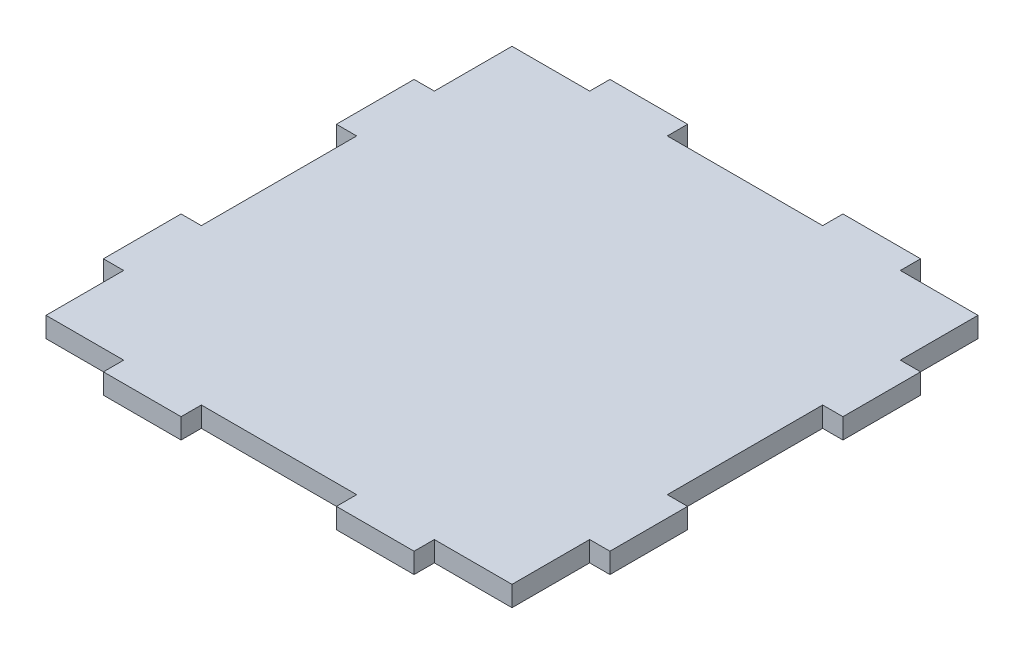
ISO-10303-21;
HEADER;
FILE_DESCRIPTION(('STEP AP214'),'2;1');
FILE_NAME('part.step','',(''),(''),'','','');
FILE_SCHEMA(('AUTOMOTIVE_DESIGN { 1 0 10303 214 1 1 1 1 }'));
ENDSEC;
DATA;
#1=APPLICATION_CONTEXT('core data for automotive mechanical design processes');
#2=APPLICATION_PROTOCOL_DEFINITION('international standard','automotive_design',2000,#1);
#3=PRODUCT_CONTEXT('',#1,'mechanical');
#4=PRODUCT('Part','Part','',(#3));
#5=PRODUCT_RELATED_PRODUCT_CATEGORY('part','',(#4));
#6=PRODUCT_DEFINITION_FORMATION('','',#4);
#7=PRODUCT_DEFINITION_CONTEXT('part definition',#1,'design');
#8=PRODUCT_DEFINITION('design','',#6,#7);
#9=PRODUCT_DEFINITION_SHAPE('','',#8);
#10=(LENGTH_UNIT() NAMED_UNIT(*) SI_UNIT(.MILLI.,.METRE.));
#11=(NAMED_UNIT(*) PLANE_ANGLE_UNIT() SI_UNIT($,.RADIAN.));
#12=(NAMED_UNIT(*) SI_UNIT($,.STERADIAN.) SOLID_ANGLE_UNIT());
#13=UNCERTAINTY_MEASURE_WITH_UNIT(LENGTH_MEASURE(1.E-05),#10,'distance_accuracy_value','');
#14=(GEOMETRIC_REPRESENTATION_CONTEXT(3) GLOBAL_UNCERTAINTY_ASSIGNED_CONTEXT((#13)) GLOBAL_UNIT_ASSIGNED_CONTEXT((#10,
#11,#12)) REPRESENTATION_CONTEXT('',''));
#15=CARTESIAN_POINT('',(0.,0.,0.));
#16=DIRECTION('',(0.,0.,1.));
#17=DIRECTION('',(1.,0.,0.));
#18=AXIS2_PLACEMENT_3D('',#15,#16,#17);
#19=CARTESIAN_POINT('',(0.,6.,-69.));
#20=DIRECTION('',(0.,0.,1.));
#21=DIRECTION('',(1.,0.,0.));
#22=AXIS2_PLACEMENT_3D('',#19,#20,#21);
#23=PLANE('',#22);
#24=DIRECTION('',(-1.,0.,0.));
#25=VECTOR('',#24,1.);
#26=CARTESIAN_POINT('',(0.,0.,-69.));
#27=LINE('',#26,#25);
#28=CARTESIAN_POINT('',(23.0000000000002,0.,-68.9999999999999));
#29=VERTEX_POINT('',#28);
#30=CARTESIAN_POINT('',(-23.,0.,-69.));
#31=VERTEX_POINT('',#30);
#32=EDGE_CURVE('E172',#29,#31,#27,.T.);
#33=ORIENTED_EDGE('',*,*,#32,.T.);
#34=DIRECTION('',(0.,-1.,0.));
#35=VECTOR('',#34,1.);
#36=CARTESIAN_POINT('',(-23.,6.,-69.));
#37=LINE('',#36,#35);
#38=CARTESIAN_POINT('',(-23.,6.,-69.));
#39=VERTEX_POINT('',#38);
#40=EDGE_CURVE('E11',#39,#31,#37,.T.);
#41=ORIENTED_EDGE('',*,*,#40,.F.);
#42=DIRECTION('',(-1.,0.,0.));
#43=VECTOR('',#42,1.);
#44=CARTESIAN_POINT('',(23.0000000000002,6.,-68.9999999999999));
#45=LINE('',#44,#43);
#46=CARTESIAN_POINT('',(23.0000000000002,6.,-68.9999999999999));
#47=VERTEX_POINT('',#46);
#48=EDGE_CURVE('E178',#47,#39,#45,.T.);
#49=ORIENTED_EDGE('',*,*,#48,.F.);
#50=DIRECTION('',(0.,-1.,0.));
#51=VECTOR('',#50,1.);
#52=CARTESIAN_POINT('',(23.0000000000002,6.,-68.9999999999999));
#53=LINE('',#52,#51);
#54=EDGE_CURVE('E296',#47,#29,#53,.T.);
#55=ORIENTED_EDGE('',*,*,#54,.T.);
#56=EDGE_LOOP('',(#33,#41,#49,#55));
#57=FACE_BOUND('',#56,.T.);
#58=ADVANCED_FACE('F36',(#57),#23,.F.);
#59=CARTESIAN_POINT('',(-23.,6.,-69.));
#60=DIRECTION('',(-1.,0.,0.));
#61=DIRECTION('',(0.,0.,1.));
#62=AXIS2_PLACEMENT_3D('',#59,#60,#61);
#63=PLANE('',#62);
#64=DIRECTION('',(0.,0.,-1.));
#65=VECTOR('',#64,1.);
#66=CARTESIAN_POINT('',(-23.,0.,-69.));
#67=LINE('',#66,#65);
#68=CARTESIAN_POINT('',(-23.,0.,-75.));
#69=VERTEX_POINT('',#68);
#70=EDGE_CURVE('E301',#31,#69,#67,.T.);
#71=ORIENTED_EDGE('',*,*,#70,.T.);
#72=DIRECTION('',(0.,-1.,0.));
#73=VECTOR('',#72,1.);
#74=CARTESIAN_POINT('',(-23.,6.,-75.));
#75=LINE('',#74,#73);
#76=CARTESIAN_POINT('',(-23.,6.,-75.));
#77=VERTEX_POINT('',#76);
#78=EDGE_CURVE('E44',#77,#69,#75,.T.);
#79=ORIENTED_EDGE('',*,*,#78,.F.);
#80=DIRECTION('',(0.,0.,-1.));
#81=VECTOR('',#80,1.);
#82=CARTESIAN_POINT('',(-23.,6.,-69.));
#83=LINE('',#82,#81);
#84=EDGE_CURVE('E560',#39,#77,#83,.T.);
#85=ORIENTED_EDGE('',*,*,#84,.F.);
#86=ORIENTED_EDGE('',*,*,#40,.T.);
#87=EDGE_LOOP('',(#71,#79,#85,#86));
#88=FACE_BOUND('',#87,.T.);
#89=ADVANCED_FACE('F563',(#88),#63,.F.);
#90=CARTESIAN_POINT('',(-23.,6.,-75.));
#91=DIRECTION('',(0.,0.,1.));
#92=DIRECTION('',(1.,0.,0.));
#93=AXIS2_PLACEMENT_3D('',#90,#91,#92);
#94=PLANE('',#93);
#95=DIRECTION('',(-1.,0.,0.));
#96=VECTOR('',#95,1.);
#97=CARTESIAN_POINT('',(-23.,0.,-75.));
#98=LINE('',#97,#96);
#99=CARTESIAN_POINT('',(-46.,0.,-75.));
#100=VERTEX_POINT('',#99);
#101=EDGE_CURVE('E303',#69,#100,#98,.T.);
#102=ORIENTED_EDGE('',*,*,#101,.T.);
#103=DIRECTION('',(0.,-1.,0.));
#104=VECTOR('',#103,1.);
#105=CARTESIAN_POINT('',(-46.,6.,-75.));
#106=LINE('',#105,#104);
#107=CARTESIAN_POINT('',(-46.,6.,-75.));
#108=VERTEX_POINT('',#107);
#109=EDGE_CURVE('E463',#108,#100,#106,.T.);
#110=ORIENTED_EDGE('',*,*,#109,.F.);
#111=DIRECTION('',(-1.,0.,0.));
#112=VECTOR('',#111,1.);
#113=CARTESIAN_POINT('',(-23.,6.,-75.));
#114=LINE('',#113,#112);
#115=EDGE_CURVE('E472',#77,#108,#114,.T.);
#116=ORIENTED_EDGE('',*,*,#115,.F.);
#117=ORIENTED_EDGE('',*,*,#78,.T.);
#118=EDGE_LOOP('',(#102,#110,#116,#117));
#119=FACE_BOUND('',#118,.T.);
#120=ADVANCED_FACE('F470',(#119),#94,.F.);
#121=CARTESIAN_POINT('',(-46.,6.,-75.));
#122=DIRECTION('',(1.,0.,0.));
#123=DIRECTION('',(0.,0.,-1.));
#124=AXIS2_PLACEMENT_3D('',#121,#122,#123);
#125=PLANE('',#124);
#126=DIRECTION('',(0.,0.,1.));
#127=VECTOR('',#126,1.);
#128=CARTESIAN_POINT('',(-46.,0.,-75.));
#129=LINE('',#128,#127);
#130=CARTESIAN_POINT('',(-46.,0.,-69.));
#131=VERTEX_POINT('',#130);
#132=EDGE_CURVE('E305',#100,#131,#129,.T.);
#133=ORIENTED_EDGE('',*,*,#132,.T.);
#134=DIRECTION('',(0.,-1.,0.));
#135=VECTOR('',#134,1.);
#136=CARTESIAN_POINT('',(-46.,6.,-69.));
#137=LINE('',#136,#135);
#138=CARTESIAN_POINT('',(-46.,6.,-69.));
#139=VERTEX_POINT('',#138);
#140=EDGE_CURVE('E460',#139,#131,#137,.T.);
#141=ORIENTED_EDGE('',*,*,#140,.F.);
#142=DIRECTION('',(0.,0.,1.));
#143=VECTOR('',#142,1.);
#144=CARTESIAN_POINT('',(-46.,6.,-75.));
#145=LINE('',#144,#143);
#146=EDGE_CURVE('E490',#108,#139,#145,.T.);
#147=ORIENTED_EDGE('',*,*,#146,.F.);
#148=ORIENTED_EDGE('',*,*,#109,.T.);
#149=EDGE_LOOP('',(#133,#141,#147,#148));
#150=FACE_BOUND('',#149,.T.);
#151=ADVANCED_FACE('F481',(#150),#125,.F.);
#152=CARTESIAN_POINT('',(-46.,6.,-69.));
#153=DIRECTION('',(0.,0.,1.));
#154=DIRECTION('',(1.,0.,0.));
#155=AXIS2_PLACEMENT_3D('',#152,#153,#154);
#156=PLANE('',#155);
#157=DIRECTION('',(-1.,0.,0.));
#158=VECTOR('',#157,1.);
#159=CARTESIAN_POINT('',(-46.,0.,-69.));
#160=LINE('',#159,#158);
#161=CARTESIAN_POINT('',(-69.,0.,-69.));
#162=VERTEX_POINT('',#161);
#163=EDGE_CURVE('E307',#131,#162,#160,.T.);
#164=ORIENTED_EDGE('',*,*,#163,.T.);
#165=DIRECTION('',(0.,-1.,0.));
#166=VECTOR('',#165,1.);
#167=CARTESIAN_POINT('',(-69.,6.,-69.));
#168=LINE('',#167,#166);
#169=CARTESIAN_POINT('',(-69.,6.,-69.));
#170=VERTEX_POINT('',#169);
#171=EDGE_CURVE('E457',#170,#162,#168,.T.);
#172=ORIENTED_EDGE('',*,*,#171,.F.);
#173=DIRECTION('',(-1.,0.,0.));
#174=VECTOR('',#173,1.);
#175=CARTESIAN_POINT('',(-46.,6.,-69.));
#176=LINE('',#175,#174);
#177=EDGE_CURVE('E487',#139,#170,#176,.T.);
#178=ORIENTED_EDGE('',*,*,#177,.F.);
#179=ORIENTED_EDGE('',*,*,#140,.T.);
#180=EDGE_LOOP('',(#164,#172,#178,#179));
#181=FACE_BOUND('',#180,.T.);
#182=ADVANCED_FACE('F485',(#181),#156,.F.);
#183=CARTESIAN_POINT('',(-69.,6.,-69.));
#184=DIRECTION('',(1.,0.,0.));
#185=DIRECTION('',(0.,0.,-1.));
#186=AXIS2_PLACEMENT_3D('',#183,#184,#185);
#187=PLANE('',#186);
#188=DIRECTION('',(0.,0.,1.));
#189=VECTOR('',#188,1.);
#190=CARTESIAN_POINT('',(-69.,0.,-69.));
#191=LINE('',#190,#189);
#192=CARTESIAN_POINT('',(-69.,0.,-46.));
#193=VERTEX_POINT('',#192);
#194=EDGE_CURVE('E309',#162,#193,#191,.T.);
#195=ORIENTED_EDGE('',*,*,#194,.T.);
#196=DIRECTION('',(0.,-1.,0.));
#197=VECTOR('',#196,1.);
#198=CARTESIAN_POINT('',(-69.,6.,-46.));
#199=LINE('',#198,#197);
#200=CARTESIAN_POINT('',(-69.,6.,-46.));
#201=VERTEX_POINT('',#200);
#202=EDGE_CURVE('E454',#201,#193,#199,.T.);
#203=ORIENTED_EDGE('',*,*,#202,.F.);
#204=DIRECTION('',(0.,0.,1.));
#205=VECTOR('',#204,1.);
#206=CARTESIAN_POINT('',(-69.,6.,-69.));
#207=LINE('',#206,#205);
#208=EDGE_CURVE('E489',#170,#201,#207,.T.);
#209=ORIENTED_EDGE('',*,*,#208,.F.);
#210=ORIENTED_EDGE('',*,*,#171,.T.);
#211=EDGE_LOOP('',(#195,#203,#209,#210));
#212=FACE_BOUND('',#211,.T.);
#213=ADVANCED_FACE('F575',(#212),#187,.F.);
#214=CARTESIAN_POINT('',(-69.,6.,-46.));
#215=DIRECTION('',(0.,0.,1.));
#216=DIRECTION('',(1.,0.,0.));
#217=AXIS2_PLACEMENT_3D('',#214,#215,#216);
#218=PLANE('',#217);
#219=DIRECTION('',(-1.,0.,0.));
#220=VECTOR('',#219,1.);
#221=CARTESIAN_POINT('',(-69.,0.,-46.));
#222=LINE('',#221,#220);
#223=CARTESIAN_POINT('',(-75.,0.,-46.));
#224=VERTEX_POINT('',#223);
#225=EDGE_CURVE('E311',#193,#224,#222,.T.);
#226=ORIENTED_EDGE('',*,*,#225,.T.);
#227=DIRECTION('',(0.,-1.,0.));
#228=VECTOR('',#227,1.);
#229=CARTESIAN_POINT('',(-75.,6.,-46.));
#230=LINE('',#229,#228);
#231=CARTESIAN_POINT('',(-75.,6.,-46.));
#232=VERTEX_POINT('',#231);
#233=EDGE_CURVE('E451',#232,#224,#230,.T.);
#234=ORIENTED_EDGE('',*,*,#233,.F.);
#235=DIRECTION('',(-1.,0.,0.));
#236=VECTOR('',#235,1.);
#237=CARTESIAN_POINT('',(-69.,6.,-46.));
#238=LINE('',#237,#236);
#239=EDGE_CURVE('E492',#201,#232,#238,.T.);
#240=ORIENTED_EDGE('',*,*,#239,.F.);
#241=ORIENTED_EDGE('',*,*,#202,.T.);
#242=EDGE_LOOP('',(#226,#234,#240,#241));
#243=FACE_BOUND('',#242,.T.);
#244=ADVANCED_FACE('F578',(#243),#218,.F.);
#245=CARTESIAN_POINT('',(-75.,6.,-46.));
#246=DIRECTION('',(1.,0.,0.));
#247=DIRECTION('',(0.,0.,-1.));
#248=AXIS2_PLACEMENT_3D('',#245,#246,#247);
#249=PLANE('',#248);
#250=DIRECTION('',(0.,0.,1.));
#251=VECTOR('',#250,1.);
#252=CARTESIAN_POINT('',(-75.,0.,-46.));
#253=LINE('',#252,#251);
#254=CARTESIAN_POINT('',(-75.,0.,-23.));
#255=VERTEX_POINT('',#254);
#256=EDGE_CURVE('E313',#224,#255,#253,.T.);
#257=ORIENTED_EDGE('',*,*,#256,.T.);
#258=DIRECTION('',(0.,-1.,0.));
#259=VECTOR('',#258,1.);
#260=CARTESIAN_POINT('',(-75.,6.,-23.));
#261=LINE('',#260,#259);
#262=CARTESIAN_POINT('',(-75.,6.,-23.));
#263=VERTEX_POINT('',#262);
#264=EDGE_CURVE('E448',#263,#255,#261,.T.);
#265=ORIENTED_EDGE('',*,*,#264,.F.);
#266=DIRECTION('',(0.,0.,1.));
#267=VECTOR('',#266,1.);
#268=CARTESIAN_POINT('',(-75.,6.,-46.));
#269=LINE('',#268,#267);
#270=EDGE_CURVE('E498',#232,#263,#269,.T.);
#271=ORIENTED_EDGE('',*,*,#270,.F.);
#272=ORIENTED_EDGE('',*,*,#233,.T.);
#273=EDGE_LOOP('',(#257,#265,#271,#272));
#274=FACE_BOUND('',#273,.T.);
#275=ADVANCED_FACE('F582',(#274),#249,.F.);
#276=CARTESIAN_POINT('',(-75.,6.,-23.));
#277=DIRECTION('',(0.,0.,-1.));
#278=DIRECTION('',(-1.,0.,0.));
#279=AXIS2_PLACEMENT_3D('',#276,#277,#278);
#280=PLANE('',#279);
#281=DIRECTION('',(1.,0.,0.));
#282=VECTOR('',#281,1.);
#283=CARTESIAN_POINT('',(-75.,0.,-23.));
#284=LINE('',#283,#282);
#285=CARTESIAN_POINT('',(-69.,0.,-23.));
#286=VERTEX_POINT('',#285);
#287=EDGE_CURVE('E315',#255,#286,#284,.T.);
#288=ORIENTED_EDGE('',*,*,#287,.T.);
#289=DIRECTION('',(0.,-1.,0.));
#290=VECTOR('',#289,1.);
#291=CARTESIAN_POINT('',(-69.,6.,-23.));
#292=LINE('',#291,#290);
#293=CARTESIAN_POINT('',(-69.,6.,-23.));
#294=VERTEX_POINT('',#293);
#295=EDGE_CURVE('E445',#294,#286,#292,.T.);
#296=ORIENTED_EDGE('',*,*,#295,.F.);
#297=DIRECTION('',(1.,0.,0.));
#298=VECTOR('',#297,1.);
#299=CARTESIAN_POINT('',(-75.,6.,-23.));
#300=LINE('',#299,#298);
#301=EDGE_CURVE('E500',#263,#294,#300,.T.);
#302=ORIENTED_EDGE('',*,*,#301,.F.);
#303=ORIENTED_EDGE('',*,*,#264,.T.);
#304=EDGE_LOOP('',(#288,#296,#302,#303));
#305=FACE_BOUND('',#304,.T.);
#306=ADVANCED_FACE('F586',(#305),#280,.F.);
#307=CARTESIAN_POINT('',(-69.,6.,0.));
#308=DIRECTION('',(1.,0.,0.));
#309=DIRECTION('',(0.,0.,-1.));
#310=AXIS2_PLACEMENT_3D('',#307,#308,#309);
#311=PLANE('',#310);
#312=DIRECTION('',(0.,0.,1.));
#313=VECTOR('',#312,1.);
#314=CARTESIAN_POINT('',(-69.,0.,0.));
#315=LINE('',#314,#313);
#316=CARTESIAN_POINT('',(-69.0000000000002,0.,22.9999999999993));
#317=VERTEX_POINT('',#316);
#318=EDGE_CURVE('E318',#286,#317,#315,.T.);
#319=ORIENTED_EDGE('',*,*,#318,.T.);
#320=DIRECTION('',(0.,-1.,0.));
#321=VECTOR('',#320,1.);
#322=CARTESIAN_POINT('',(-69.0000000000002,6.,22.9999999999993));
#323=LINE('',#322,#321);
#324=CARTESIAN_POINT('',(-69.0000000000002,6.,22.9999999999993));
#325=VERTEX_POINT('',#324);
#326=EDGE_CURVE('E442',#325,#317,#323,.T.);
#327=ORIENTED_EDGE('',*,*,#326,.F.);
#328=DIRECTION('',(0.,0.,1.));
#329=VECTOR('',#328,1.);
#330=CARTESIAN_POINT('',(-69.,6.,-23.));
#331=LINE('',#330,#329);
#332=EDGE_CURVE('E502',#294,#325,#331,.T.);
#333=ORIENTED_EDGE('',*,*,#332,.F.);
#334=ORIENTED_EDGE('',*,*,#295,.T.);
#335=EDGE_LOOP('',(#319,#327,#333,#334));
#336=FACE_BOUND('',#335,.T.);
#337=ADVANCED_FACE('F590',(#336),#311,.F.);
#338=CARTESIAN_POINT('',(-69.0000000000002,6.,22.9999999999993));
#339=DIRECTION('',(1.21430643318381E-13,0.,1.));
#340=DIRECTION('',(1.,0.,-1.21430643318381E-13));
#341=AXIS2_PLACEMENT_3D('',#338,#339,#340);
#342=PLANE('',#341);
#343=DIRECTION('',(-1.,0.,1.21430643318381E-13));
#344=VECTOR('',#343,1.);
#345=CARTESIAN_POINT('',(-69.0000000000002,0.,22.9999999999993));
#346=LINE('',#345,#344);
#347=CARTESIAN_POINT('',(-75.,0.,23.));
#348=VERTEX_POINT('',#347);
#349=EDGE_CURVE('E320',#317,#348,#346,.T.);
#350=ORIENTED_EDGE('',*,*,#349,.T.);
#351=DIRECTION('',(0.,-1.,0.));
#352=VECTOR('',#351,1.);
#353=CARTESIAN_POINT('',(-75.,6.,23.));
#354=LINE('',#353,#352);
#355=CARTESIAN_POINT('',(-75.,6.,23.));
#356=VERTEX_POINT('',#355);
#357=EDGE_CURVE('E439',#356,#348,#354,.T.);
#358=ORIENTED_EDGE('',*,*,#357,.F.);
#359=DIRECTION('',(-1.,0.,1.21430643318381E-13));
#360=VECTOR('',#359,1.);
#361=CARTESIAN_POINT('',(-69.0000000000002,6.,22.9999999999993));
#362=LINE('',#361,#360);
#363=EDGE_CURVE('E504',#325,#356,#362,.T.);
#364=ORIENTED_EDGE('',*,*,#363,.F.);
#365=ORIENTED_EDGE('',*,*,#326,.T.);
#366=EDGE_LOOP('',(#350,#358,#364,#365));
#367=FACE_BOUND('',#366,.T.);
#368=ADVANCED_FACE('F594',(#367),#342,.F.);
#369=CARTESIAN_POINT('',(-75.,6.,23.));
#370=DIRECTION('',(1.,0.,0.));
#371=DIRECTION('',(0.,0.,-1.));
#372=AXIS2_PLACEMENT_3D('',#369,#370,#371);
#373=PLANE('',#372);
#374=DIRECTION('',(0.,0.,1.));
#375=VECTOR('',#374,1.);
#376=CARTESIAN_POINT('',(-75.,0.,23.));
#377=LINE('',#376,#375);
#378=CARTESIAN_POINT('',(-75.,0.,46.));
#379=VERTEX_POINT('',#378);
#380=EDGE_CURVE('E322',#348,#379,#377,.T.);
#381=ORIENTED_EDGE('',*,*,#380,.T.);
#382=DIRECTION('',(0.,-1.,0.));
#383=VECTOR('',#382,1.);
#384=CARTESIAN_POINT('',(-75.,6.,46.));
#385=LINE('',#384,#383);
#386=CARTESIAN_POINT('',(-75.,6.,46.));
#387=VERTEX_POINT('',#386);
#388=EDGE_CURVE('E436',#387,#379,#385,.T.);
#389=ORIENTED_EDGE('',*,*,#388,.F.);
#390=DIRECTION('',(0.,0.,1.));
#391=VECTOR('',#390,1.);
#392=CARTESIAN_POINT('',(-75.,6.,23.));
#393=LINE('',#392,#391);
#394=EDGE_CURVE('E506',#356,#387,#393,.T.);
#395=ORIENTED_EDGE('',*,*,#394,.F.);
#396=ORIENTED_EDGE('',*,*,#357,.T.);
#397=EDGE_LOOP('',(#381,#389,#395,#396));
#398=FACE_BOUND('',#397,.T.);
#399=ADVANCED_FACE('F598',(#398),#373,.F.);
#400=CARTESIAN_POINT('',(-75.,6.,46.));
#401=DIRECTION('',(-1.21430643318387E-13,0.,-1.));
#402=DIRECTION('',(-1.,0.,1.21430643318387E-13));
#403=AXIS2_PLACEMENT_3D('',#400,#401,#402);
#404=PLANE('',#403);
#405=DIRECTION('',(1.,0.,-1.21430643318387E-13));
#406=VECTOR('',#405,1.);
#407=CARTESIAN_POINT('',(-75.,0.,46.));
#408=LINE('',#407,#406);
#409=CARTESIAN_POINT('',(-69.0000000000005,0.,45.9999999999993));
#410=VERTEX_POINT('',#409);
#411=EDGE_CURVE('E324',#379,#410,#408,.T.);
#412=ORIENTED_EDGE('',*,*,#411,.T.);
#413=DIRECTION('',(0.,-1.,0.));
#414=VECTOR('',#413,1.);
#415=CARTESIAN_POINT('',(-69.0000000000005,6.,45.9999999999993));
#416=LINE('',#415,#414);
#417=CARTESIAN_POINT('',(-69.0000000000005,6.,45.9999999999993));
#418=VERTEX_POINT('',#417);
#419=EDGE_CURVE('E433',#418,#410,#416,.T.);
#420=ORIENTED_EDGE('',*,*,#419,.F.);
#421=DIRECTION('',(1.,0.,-1.21430643318387E-13));
#422=VECTOR('',#421,1.);
#423=CARTESIAN_POINT('',(-75.,6.,46.));
#424=LINE('',#423,#422);
#425=EDGE_CURVE('E508',#387,#418,#424,.T.);
#426=ORIENTED_EDGE('',*,*,#425,.F.);
#427=ORIENTED_EDGE('',*,*,#388,.T.);
#428=EDGE_LOOP('',(#412,#420,#426,#427));
#429=FACE_BOUND('',#428,.T.);
#430=ADVANCED_FACE('F602',(#429),#404,.F.);
#431=CARTESIAN_POINT('',(-69.0000000000005,6.,45.9999999999993));
#432=DIRECTION('',(1.,0.,0.));
#433=DIRECTION('',(0.,0.,-1.));
#434=AXIS2_PLACEMENT_3D('',#431,#432,#433);
#435=PLANE('',#434);
#436=DIRECTION('',(0.,0.,1.));
#437=VECTOR('',#436,1.);
#438=CARTESIAN_POINT('',(-69.0000000000005,0.,45.9999999999993));
#439=LINE('',#438,#437);
#440=CARTESIAN_POINT('',(-69.0000000000007,0.,68.9999999999993));
#441=VERTEX_POINT('',#440);
#442=EDGE_CURVE('E326',#410,#441,#439,.T.);
#443=ORIENTED_EDGE('',*,*,#442,.T.);
#444=DIRECTION('',(0.,-1.,0.));
#445=VECTOR('',#444,1.);
#446=CARTESIAN_POINT('',(-69.0000000000007,6.,68.9999999999993));
#447=LINE('',#446,#445);
#448=CARTESIAN_POINT('',(-69.0000000000007,6.,68.9999999999993));
#449=VERTEX_POINT('',#448);
#450=EDGE_CURVE('E430',#449,#441,#447,.T.);
#451=ORIENTED_EDGE('',*,*,#450,.F.);
#452=DIRECTION('',(0.,0.,1.));
#453=VECTOR('',#452,1.);
#454=CARTESIAN_POINT('',(-69.0000000000005,6.,45.9999999999993));
#455=LINE('',#454,#453);
#456=EDGE_CURVE('E510',#418,#449,#455,.T.);
#457=ORIENTED_EDGE('',*,*,#456,.F.);
#458=ORIENTED_EDGE('',*,*,#419,.T.);
#459=EDGE_LOOP('',(#443,#451,#457,#458));
#460=FACE_BOUND('',#459,.T.);
#461=ADVANCED_FACE('F606',(#460),#435,.F.);
#462=CARTESIAN_POINT('',(-69.0000000000007,6.,68.9999999999993));
#463=DIRECTION('',(0.,0.,-1.));
#464=DIRECTION('',(-1.,0.,0.));
#465=AXIS2_PLACEMENT_3D('',#462,#463,#464);
#466=PLANE('',#465);
#467=DIRECTION('',(1.,0.,0.));
#468=VECTOR('',#467,1.);
#469=CARTESIAN_POINT('',(-69.0000000000007,0.,68.9999999999993));
#470=LINE('',#469,#468);
#471=CARTESIAN_POINT('',(-46.0000000000007,0.,68.9999999999995));
#472=VERTEX_POINT('',#471);
#473=EDGE_CURVE('E328',#441,#472,#470,.T.);
#474=ORIENTED_EDGE('',*,*,#473,.T.);
#475=DIRECTION('',(0.,-1.,0.));
#476=VECTOR('',#475,1.);
#477=CARTESIAN_POINT('',(-46.0000000000007,6.,68.9999999999995));
#478=LINE('',#477,#476);
#479=CARTESIAN_POINT('',(-46.0000000000007,6.,68.9999999999995));
#480=VERTEX_POINT('',#479);
#481=EDGE_CURVE('E427',#480,#472,#478,.T.);
#482=ORIENTED_EDGE('',*,*,#481,.F.);
#483=DIRECTION('',(1.,0.,0.));
#484=VECTOR('',#483,1.);
#485=CARTESIAN_POINT('',(-69.0000000000007,6.,68.9999999999993));
#486=LINE('',#485,#484);
#487=EDGE_CURVE('E512',#449,#480,#486,.T.);
#488=ORIENTED_EDGE('',*,*,#487,.F.);
#489=ORIENTED_EDGE('',*,*,#450,.T.);
#490=EDGE_LOOP('',(#474,#482,#488,#489));
#491=FACE_BOUND('',#490,.T.);
#492=ADVANCED_FACE('F610',(#491),#466,.F.);
#493=CARTESIAN_POINT('',(-46.0000000000007,6.,68.9999999999995));
#494=DIRECTION('',(1.,0.,-1.22587125635684E-13));
#495=DIRECTION('',(-1.22587125635684E-13,0.,-1.));
#496=AXIS2_PLACEMENT_3D('',#493,#494,#495);
#497=PLANE('',#496);
#498=DIRECTION('',(1.22587125635684E-13,0.,1.));
#499=VECTOR('',#498,1.);
#500=CARTESIAN_POINT('',(-46.0000000000007,0.,68.9999999999995));
#501=LINE('',#500,#499);
#502=CARTESIAN_POINT('',(-46.,0.,75.));
#503=VERTEX_POINT('',#502);
#504=EDGE_CURVE('E330',#472,#503,#501,.T.);
#505=ORIENTED_EDGE('',*,*,#504,.T.);
#506=DIRECTION('',(0.,-1.,0.));
#507=VECTOR('',#506,1.);
#508=CARTESIAN_POINT('',(-46.,6.,75.));
#509=LINE('',#508,#507);
#510=CARTESIAN_POINT('',(-46.,6.,75.));
#511=VERTEX_POINT('',#510);
#512=EDGE_CURVE('E424',#511,#503,#509,.T.);
#513=ORIENTED_EDGE('',*,*,#512,.F.);
#514=DIRECTION('',(1.22587125635684E-13,0.,1.));
#515=VECTOR('',#514,1.);
#516=CARTESIAN_POINT('',(-46.0000000000007,6.,68.9999999999995));
#517=LINE('',#516,#515);
#518=EDGE_CURVE('E514',#480,#511,#517,.T.);
#519=ORIENTED_EDGE('',*,*,#518,.F.);
#520=ORIENTED_EDGE('',*,*,#481,.T.);
#521=EDGE_LOOP('',(#505,#513,#519,#520));
#522=FACE_BOUND('',#521,.T.);
#523=ADVANCED_FACE('F614',(#522),#497,.F.);
#524=CARTESIAN_POINT('',(-46.,6.,75.));
#525=DIRECTION('',(0.,0.,-1.));
#526=DIRECTION('',(-1.,0.,0.));
#527=AXIS2_PLACEMENT_3D('',#524,#525,#526);
#528=PLANE('',#527);
#529=DIRECTION('',(1.,0.,0.));
#530=VECTOR('',#529,1.);
#531=CARTESIAN_POINT('',(-46.,0.,75.));
#532=LINE('',#531,#530);
#533=CARTESIAN_POINT('',(-23.,0.,75.));
#534=VERTEX_POINT('',#533);
#535=EDGE_CURVE('E332',#503,#534,#532,.T.);
#536=ORIENTED_EDGE('',*,*,#535,.T.);
#537=DIRECTION('',(0.,-1.,0.));
#538=VECTOR('',#537,1.);
#539=CARTESIAN_POINT('',(-23.,6.,75.));
#540=LINE('',#539,#538);
#541=CARTESIAN_POINT('',(-23.,6.,75.));
#542=VERTEX_POINT('',#541);
#543=EDGE_CURVE('E421',#542,#534,#540,.T.);
#544=ORIENTED_EDGE('',*,*,#543,.F.);
#545=DIRECTION('',(1.,0.,0.));
#546=VECTOR('',#545,1.);
#547=CARTESIAN_POINT('',(-46.,6.,75.));
#548=LINE('',#547,#546);
#549=EDGE_CURVE('E516',#511,#542,#548,.T.);
#550=ORIENTED_EDGE('',*,*,#549,.F.);
#551=ORIENTED_EDGE('',*,*,#512,.T.);
#552=EDGE_LOOP('',(#536,#544,#550,#551));
#553=FACE_BOUND('',#552,.T.);
#554=ADVANCED_FACE('F618',(#553),#528,.F.);
#555=CARTESIAN_POINT('',(-23.,6.,75.));
#556=DIRECTION('',(-1.,0.,1.2258712563569E-13));
#557=DIRECTION('',(1.2258712563569E-13,0.,1.));
#558=AXIS2_PLACEMENT_3D('',#555,#556,#557);
#559=PLANE('',#558);
#560=DIRECTION('',(-1.2258712563569E-13,0.,-1.));
#561=VECTOR('',#560,1.);
#562=CARTESIAN_POINT('',(-23.,0.,75.));
#563=LINE('',#562,#561);
#564=CARTESIAN_POINT('',(-23.0000000000007,0.,68.9999999999998));
#565=VERTEX_POINT('',#564);
#566=EDGE_CURVE('E334',#534,#565,#563,.T.);
#567=ORIENTED_EDGE('',*,*,#566,.T.);
#568=DIRECTION('',(0.,-1.,0.));
#569=VECTOR('',#568,1.);
#570=CARTESIAN_POINT('',(-23.0000000000007,6.,68.9999999999998));
#571=LINE('',#570,#569);
#572=CARTESIAN_POINT('',(-23.0000000000007,6.,68.9999999999998));
#573=VERTEX_POINT('',#572);
#574=EDGE_CURVE('E418',#573,#565,#571,.T.);
#575=ORIENTED_EDGE('',*,*,#574,.F.);
#576=DIRECTION('',(-1.2258712563569E-13,0.,-1.));
#577=VECTOR('',#576,1.);
#578=CARTESIAN_POINT('',(-23.,6.,75.));
#579=LINE('',#578,#577);
#580=EDGE_CURVE('E518',#542,#573,#579,.T.);
#581=ORIENTED_EDGE('',*,*,#580,.F.);
#582=ORIENTED_EDGE('',*,*,#543,.T.);
#583=EDGE_LOOP('',(#567,#575,#581,#582));
#584=FACE_BOUND('',#583,.T.);
#585=ADVANCED_FACE('F622',(#584),#559,.F.);
#586=CARTESIAN_POINT('',(-4.81824424760352E-13,6.,69.));
#587=DIRECTION('',(0.,0.,-1.));
#588=DIRECTION('',(-1.,0.,0.));
#589=AXIS2_PLACEMENT_3D('',#586,#587,#588);
#590=PLANE('',#589);
#591=DIRECTION('',(1.,0.,0.));
#592=VECTOR('',#591,1.);
#593=CARTESIAN_POINT('',(-4.81824424760352E-13,0.,69.));
#594=LINE('',#593,#592);
#595=CARTESIAN_POINT('',(22.9999999999995,0.,69.0000000000002));
#596=VERTEX_POINT('',#595);
#597=EDGE_CURVE('E337',#565,#596,#594,.T.);
#598=ORIENTED_EDGE('',*,*,#597,.T.);
#599=DIRECTION('',(0.,-1.,0.));
#600=VECTOR('',#599,1.);
#601=CARTESIAN_POINT('',(22.9999999999995,6.,69.0000000000002));
#602=LINE('',#601,#600);
#603=CARTESIAN_POINT('',(22.9999999999995,6.,69.0000000000002));
#604=VERTEX_POINT('',#603);
#605=EDGE_CURVE('E415',#604,#596,#602,.T.);
#606=ORIENTED_EDGE('',*,*,#605,.F.);
#607=DIRECTION('',(1.,0.,0.));
#608=VECTOR('',#607,1.);
#609=CARTESIAN_POINT('',(-23.0000000000007,6.,68.9999999999998));
#610=LINE('',#609,#608);
#611=EDGE_CURVE('E520',#573,#604,#610,.T.);
#612=ORIENTED_EDGE('',*,*,#611,.F.);
#613=ORIENTED_EDGE('',*,*,#574,.T.);
#614=EDGE_LOOP('',(#598,#606,#612,#613));
#615=FACE_BOUND('',#614,.T.);
#616=ADVANCED_FACE('F626',(#615),#590,.F.);
#617=CARTESIAN_POINT('',(22.9999999999995,6.,69.0000000000002));
#618=DIRECTION('',(1.,0.,0.));
#619=DIRECTION('',(0.,0.,-1.));
#620=AXIS2_PLACEMENT_3D('',#617,#618,#619);
#621=PLANE('',#620);
#622=DIRECTION('',(0.,0.,1.));
#623=VECTOR('',#622,1.);
#624=CARTESIAN_POINT('',(22.9999999999995,0.,69.0000000000002));
#625=LINE('',#624,#623);
#626=CARTESIAN_POINT('',(23.,0.,75.));
#627=VERTEX_POINT('',#626);
#628=EDGE_CURVE('E339',#596,#627,#625,.T.);
#629=ORIENTED_EDGE('',*,*,#628,.T.);
#630=DIRECTION('',(0.,-1.,0.));
#631=VECTOR('',#630,1.);
#632=CARTESIAN_POINT('',(23.,6.,75.));
#633=LINE('',#632,#631);
#634=CARTESIAN_POINT('',(23.,6.,75.));
#635=VERTEX_POINT('',#634);
#636=EDGE_CURVE('E412',#635,#627,#633,.T.);
#637=ORIENTED_EDGE('',*,*,#636,.F.);
#638=DIRECTION('',(0.,0.,1.));
#639=VECTOR('',#638,1.);
#640=CARTESIAN_POINT('',(22.9999999999995,6.,69.0000000000002));
#641=LINE('',#640,#639);
#642=EDGE_CURVE('E522',#604,#635,#641,.T.);
#643=ORIENTED_EDGE('',*,*,#642,.F.);
#644=ORIENTED_EDGE('',*,*,#605,.T.);
#645=EDGE_LOOP('',(#629,#637,#643,#644));
#646=FACE_BOUND('',#645,.T.);
#647=ADVANCED_FACE('F630',(#646),#621,.F.);
#648=CARTESIAN_POINT('',(23.,6.,75.));
#649=DIRECTION('',(0.,0.,-1.));
#650=DIRECTION('',(-1.,0.,0.));
#651=AXIS2_PLACEMENT_3D('',#648,#649,#650);
#652=PLANE('',#651);
#653=DIRECTION('',(1.,0.,0.));
#654=VECTOR('',#653,1.);
#655=CARTESIAN_POINT('',(23.,0.,75.));
#656=LINE('',#655,#654);
#657=CARTESIAN_POINT('',(46.,0.,75.));
#658=VERTEX_POINT('',#657);
#659=EDGE_CURVE('E341',#627,#658,#656,.T.);
#660=ORIENTED_EDGE('',*,*,#659,.T.);
#661=DIRECTION('',(0.,-1.,0.));
#662=VECTOR('',#661,1.);
#663=CARTESIAN_POINT('',(46.,6.,75.));
#664=LINE('',#663,#662);
#665=CARTESIAN_POINT('',(46.,6.,75.));
#666=VERTEX_POINT('',#665);
#667=EDGE_CURVE('E409',#666,#658,#664,.T.);
#668=ORIENTED_EDGE('',*,*,#667,.F.);
#669=DIRECTION('',(1.,0.,0.));
#670=VECTOR('',#669,1.);
#671=CARTESIAN_POINT('',(23.,6.,75.));
#672=LINE('',#671,#670);
#673=EDGE_CURVE('E524',#635,#666,#672,.T.);
#674=ORIENTED_EDGE('',*,*,#673,.F.);
#675=ORIENTED_EDGE('',*,*,#636,.T.);
#676=EDGE_LOOP('',(#660,#668,#674,#675));
#677=FACE_BOUND('',#676,.T.);
#678=ADVANCED_FACE('F634',(#677),#652,.F.);
#679=CARTESIAN_POINT('',(46.,6.,75.));
#680=DIRECTION('',(-1.,0.,0.));
#681=DIRECTION('',(0.,0.,1.));
#682=AXIS2_PLACEMENT_3D('',#679,#680,#681);
#683=PLANE('',#682);
#684=DIRECTION('',(0.,0.,-1.));
#685=VECTOR('',#684,1.);
#686=CARTESIAN_POINT('',(46.,0.,75.));
#687=LINE('',#686,#685);
#688=CARTESIAN_POINT('',(45.9999999999995,0.,69.0000000000003));
#689=VERTEX_POINT('',#688);
#690=EDGE_CURVE('E343',#658,#689,#687,.T.);
#691=ORIENTED_EDGE('',*,*,#690,.T.);
#692=DIRECTION('',(0.,-1.,0.));
#693=VECTOR('',#692,1.);
#694=CARTESIAN_POINT('',(45.9999999999995,6.,69.0000000000003));
#695=LINE('',#694,#693);
#696=CARTESIAN_POINT('',(45.9999999999995,6.,69.0000000000003));
#697=VERTEX_POINT('',#696);
#698=EDGE_CURVE('E406',#697,#689,#695,.T.);
#699=ORIENTED_EDGE('',*,*,#698,.F.);
#700=DIRECTION('',(0.,0.,-1.));
#701=VECTOR('',#700,1.);
#702=CARTESIAN_POINT('',(46.,6.,75.));
#703=LINE('',#702,#701);
#704=EDGE_CURVE('E526',#666,#697,#703,.T.);
#705=ORIENTED_EDGE('',*,*,#704,.F.);
#706=ORIENTED_EDGE('',*,*,#667,.T.);
#707=EDGE_LOOP('',(#691,#699,#705,#706));
#708=FACE_BOUND('',#707,.T.);
#709=ADVANCED_FACE('F638',(#708),#683,.F.);
#710=CARTESIAN_POINT('',(45.9999999999995,6.,69.0000000000003));
#711=DIRECTION('',(0.,0.,-1.));
#712=DIRECTION('',(-1.,0.,0.));
#713=AXIS2_PLACEMENT_3D('',#710,#711,#712);
#714=PLANE('',#713);
#715=DIRECTION('',(1.,0.,0.));
#716=VECTOR('',#715,1.);
#717=CARTESIAN_POINT('',(45.9999999999995,0.,69.0000000000003));
#718=LINE('',#717,#716);
#719=CARTESIAN_POINT('',(68.9999999999995,0.,69.0000000000005));
#720=VERTEX_POINT('',#719);
#721=EDGE_CURVE('E345',#689,#720,#718,.T.);
#722=ORIENTED_EDGE('',*,*,#721,.T.);
#723=DIRECTION('',(0.,-1.,0.));
#724=VECTOR('',#723,1.);
#725=CARTESIAN_POINT('',(68.9999999999995,6.,69.0000000000005));
#726=LINE('',#725,#724);
#727=CARTESIAN_POINT('',(68.9999999999995,6.,69.0000000000005));
#728=VERTEX_POINT('',#727);
#729=EDGE_CURVE('E403',#728,#720,#726,.T.);
#730=ORIENTED_EDGE('',*,*,#729,.F.);
#731=DIRECTION('',(1.,0.,0.));
#732=VECTOR('',#731,1.);
#733=CARTESIAN_POINT('',(45.9999999999995,6.,69.0000000000003));
#734=LINE('',#733,#732);
#735=EDGE_CURVE('E528',#697,#728,#734,.T.);
#736=ORIENTED_EDGE('',*,*,#735,.F.);
#737=ORIENTED_EDGE('',*,*,#698,.T.);
#738=EDGE_LOOP('',(#722,#730,#736,#737));
#739=FACE_BOUND('',#738,.T.);
#740=ADVANCED_FACE('F642',(#739),#714,.F.);
#741=CARTESIAN_POINT('',(68.9999999999995,6.,69.0000000000005));
#742=DIRECTION('',(-1.,0.,0.));
#743=DIRECTION('',(0.,0.,1.));
#744=AXIS2_PLACEMENT_3D('',#741,#742,#743);
#745=PLANE('',#744);
#746=DIRECTION('',(0.,0.,-1.));
#747=VECTOR('',#746,1.);
#748=CARTESIAN_POINT('',(68.9999999999995,0.,69.0000000000005));
#749=LINE('',#748,#747);
#750=CARTESIAN_POINT('',(68.9999999999997,0.,46.0000000000005));
#751=VERTEX_POINT('',#750);
#752=EDGE_CURVE('E347',#720,#751,#749,.T.);
#753=ORIENTED_EDGE('',*,*,#752,.T.);
#754=DIRECTION('',(0.,-1.,0.));
#755=VECTOR('',#754,1.);
#756=CARTESIAN_POINT('',(68.9999999999997,6.,46.0000000000005));
#757=LINE('',#756,#755);
#758=CARTESIAN_POINT('',(68.9999999999997,6.,46.0000000000005));
#759=VERTEX_POINT('',#758);
#760=EDGE_CURVE('E400',#759,#751,#757,.T.);
#761=ORIENTED_EDGE('',*,*,#760,.F.);
#762=DIRECTION('',(0.,0.,-1.));
#763=VECTOR('',#762,1.);
#764=CARTESIAN_POINT('',(68.9999999999995,6.,69.0000000000005));
#765=LINE('',#764,#763);
#766=EDGE_CURVE('E530',#728,#759,#765,.T.);
#767=ORIENTED_EDGE('',*,*,#766,.F.);
#768=ORIENTED_EDGE('',*,*,#729,.T.);
#769=EDGE_LOOP('',(#753,#761,#767,#768));
#770=FACE_BOUND('',#769,.T.);
#771=ADVANCED_FACE('F646',(#770),#745,.F.);
#772=CARTESIAN_POINT('',(68.9999999999997,6.,46.0000000000005));
#773=DIRECTION('',(0.,0.,-1.));
#774=DIRECTION('',(-1.,0.,0.));
#775=AXIS2_PLACEMENT_3D('',#772,#773,#774);
#776=PLANE('',#775);
#777=DIRECTION('',(1.,0.,0.));
#778=VECTOR('',#777,1.);
#779=CARTESIAN_POINT('',(68.9999999999997,0.,46.0000000000005));
#780=LINE('',#779,#778);
#781=CARTESIAN_POINT('',(75.,0.,46.));
#782=VERTEX_POINT('',#781);
#783=EDGE_CURVE('E349',#751,#782,#780,.T.);
#784=ORIENTED_EDGE('',*,*,#783,.T.);
#785=DIRECTION('',(0.,-1.,0.));
#786=VECTOR('',#785,1.);
#787=CARTESIAN_POINT('',(75.,6.,46.));
#788=LINE('',#787,#786);
#789=CARTESIAN_POINT('',(75.,6.,46.));
#790=VERTEX_POINT('',#789);
#791=EDGE_CURVE('E397',#790,#782,#788,.T.);
#792=ORIENTED_EDGE('',*,*,#791,.F.);
#793=DIRECTION('',(1.,0.,0.));
#794=VECTOR('',#793,1.);
#795=CARTESIAN_POINT('',(68.9999999999997,6.,46.0000000000005));
#796=LINE('',#795,#794);
#797=EDGE_CURVE('E532',#759,#790,#796,.T.);
#798=ORIENTED_EDGE('',*,*,#797,.F.);
#799=ORIENTED_EDGE('',*,*,#760,.T.);
#800=EDGE_LOOP('',(#784,#792,#798,#799));
#801=FACE_BOUND('',#800,.T.);
#802=ADVANCED_FACE('F650',(#801),#776,.F.);
#803=CARTESIAN_POINT('',(75.,6.,46.));
#804=DIRECTION('',(-1.,0.,0.));
#805=DIRECTION('',(0.,0.,1.));
#806=AXIS2_PLACEMENT_3D('',#803,#804,#805);
#807=PLANE('',#806);
#808=DIRECTION('',(0.,0.,-1.));
#809=VECTOR('',#808,1.);
#810=CARTESIAN_POINT('',(75.,0.,46.));
#811=LINE('',#810,#809);
#812=CARTESIAN_POINT('',(75.,0.,23.));
#813=VERTEX_POINT('',#812);
#814=EDGE_CURVE('E351',#782,#813,#811,.T.);
#815=ORIENTED_EDGE('',*,*,#814,.T.);
#816=DIRECTION('',(0.,-1.,0.));
#817=VECTOR('',#816,1.);
#818=CARTESIAN_POINT('',(75.,6.,23.));
#819=LINE('',#818,#817);
#820=CARTESIAN_POINT('',(75.,6.,23.));
#821=VERTEX_POINT('',#820);
#822=EDGE_CURVE('E394',#821,#813,#819,.T.);
#823=ORIENTED_EDGE('',*,*,#822,.F.);
#824=DIRECTION('',(0.,0.,-1.));
#825=VECTOR('',#824,1.);
#826=CARTESIAN_POINT('',(75.,6.,46.));
#827=LINE('',#826,#825);
#828=EDGE_CURVE('E534',#790,#821,#827,.T.);
#829=ORIENTED_EDGE('',*,*,#828,.F.);
#830=ORIENTED_EDGE('',*,*,#791,.T.);
#831=EDGE_LOOP('',(#815,#823,#829,#830));
#832=FACE_BOUND('',#831,.T.);
#833=ADVANCED_FACE('F654',(#832),#807,.F.);
#834=CARTESIAN_POINT('',(75.,6.,23.));
#835=DIRECTION('',(0.,0.,1.));
#836=DIRECTION('',(1.,0.,0.));
#837=AXIS2_PLACEMENT_3D('',#834,#835,#836);
#838=PLANE('',#837);
#839=DIRECTION('',(-1.,0.,0.));
#840=VECTOR('',#839,1.);
#841=CARTESIAN_POINT('',(75.,0.,23.));
#842=LINE('',#841,#840);
#843=CARTESIAN_POINT('',(68.9999999999998,0.,23.0000000000005));
#844=VERTEX_POINT('',#843);
#845=EDGE_CURVE('E353',#813,#844,#842,.T.);
#846=ORIENTED_EDGE('',*,*,#845,.T.);
#847=DIRECTION('',(0.,-1.,0.));
#848=VECTOR('',#847,1.);
#849=CARTESIAN_POINT('',(68.9999999999998,6.,23.0000000000005));
#850=LINE('',#849,#848);
#851=CARTESIAN_POINT('',(68.9999999999998,6.,23.0000000000005));
#852=VERTEX_POINT('',#851);
#853=EDGE_CURVE('E391',#852,#844,#850,.T.);
#854=ORIENTED_EDGE('',*,*,#853,.F.);
#855=DIRECTION('',(-1.,0.,0.));
#856=VECTOR('',#855,1.);
#857=CARTESIAN_POINT('',(75.,6.,23.));
#858=LINE('',#857,#856);
#859=EDGE_CURVE('E536',#821,#852,#858,.T.);
#860=ORIENTED_EDGE('',*,*,#859,.F.);
#861=ORIENTED_EDGE('',*,*,#822,.T.);
#862=EDGE_LOOP('',(#846,#854,#860,#861));
#863=FACE_BOUND('',#862,.T.);
#864=ADVANCED_FACE('F658',(#863),#838,.F.);
#865=CARTESIAN_POINT('',(69.,6.,2.40912212380176E-13));
#866=DIRECTION('',(-1.,0.,0.));
#867=DIRECTION('',(0.,0.,1.));
#868=AXIS2_PLACEMENT_3D('',#865,#866,#867);
#869=PLANE('',#868);
#870=DIRECTION('',(0.,0.,-1.));
#871=VECTOR('',#870,1.);
#872=CARTESIAN_POINT('',(69.,0.,2.40912212380176E-13));
#873=LINE('',#872,#871);
#874=CARTESIAN_POINT('',(69.0000000000001,0.,-22.9999999999998));
#875=VERTEX_POINT('',#874);
#876=EDGE_CURVE('E356',#844,#875,#873,.T.);
#877=ORIENTED_EDGE('',*,*,#876,.T.);
#878=DIRECTION('',(0.,-1.,0.));
#879=VECTOR('',#878,1.);
#880=CARTESIAN_POINT('',(69.0000000000001,6.,-22.9999999999998));
#881=LINE('',#880,#879);
#882=CARTESIAN_POINT('',(69.0000000000001,6.,-22.9999999999998));
#883=VERTEX_POINT('',#882);
#884=EDGE_CURVE('E388',#883,#875,#881,.T.);
#885=ORIENTED_EDGE('',*,*,#884,.F.);
#886=DIRECTION('',(0.,0.,-1.));
#887=VECTOR('',#886,1.);
#888=CARTESIAN_POINT('',(68.9999999999998,6.,23.0000000000005));
#889=LINE('',#888,#887);
#890=EDGE_CURVE('E538',#852,#883,#889,.T.);
#891=ORIENTED_EDGE('',*,*,#890,.F.);
#892=ORIENTED_EDGE('',*,*,#853,.T.);
#893=EDGE_LOOP('',(#877,#885,#891,#892));
#894=FACE_BOUND('',#893,.T.);
#895=ADVANCED_FACE('F662',(#894),#869,.F.);
#896=CARTESIAN_POINT('',(69.0000000000001,6.,-22.9999999999998));
#897=DIRECTION('',(0.,0.,-1.));
#898=DIRECTION('',(-1.,0.,0.));
#899=AXIS2_PLACEMENT_3D('',#896,#897,#898);
#900=PLANE('',#899);
#901=DIRECTION('',(1.,0.,0.));
#902=VECTOR('',#901,1.);
#903=CARTESIAN_POINT('',(69.0000000000001,0.,-22.9999999999998));
#904=LINE('',#903,#902);
#905=CARTESIAN_POINT('',(75.,0.,-23.));
#906=VERTEX_POINT('',#905);
#907=EDGE_CURVE('E358',#875,#906,#904,.T.);
#908=ORIENTED_EDGE('',*,*,#907,.T.);
#909=DIRECTION('',(0.,-1.,0.));
#910=VECTOR('',#909,1.);
#911=CARTESIAN_POINT('',(75.,6.,-23.));
#912=LINE('',#911,#910);
#913=CARTESIAN_POINT('',(75.,6.,-23.));
#914=VERTEX_POINT('',#913);
#915=EDGE_CURVE('E385',#914,#906,#912,.T.);
#916=ORIENTED_EDGE('',*,*,#915,.F.);
#917=DIRECTION('',(1.,0.,0.));
#918=VECTOR('',#917,1.);
#919=CARTESIAN_POINT('',(69.0000000000001,6.,-22.9999999999998));
#920=LINE('',#919,#918);
#921=EDGE_CURVE('E540',#883,#914,#920,.T.);
#922=ORIENTED_EDGE('',*,*,#921,.F.);
#923=ORIENTED_EDGE('',*,*,#884,.T.);
#924=EDGE_LOOP('',(#908,#916,#922,#923));
#925=FACE_BOUND('',#924,.T.);
#926=ADVANCED_FACE('F666',(#925),#900,.F.);
#927=CARTESIAN_POINT('',(75.,6.,-23.));
#928=DIRECTION('',(-1.,0.,0.));
#929=DIRECTION('',(0.,0.,1.));
#930=AXIS2_PLACEMENT_3D('',#927,#928,#929);
#931=PLANE('',#930);
#932=DIRECTION('',(0.,0.,-1.));
#933=VECTOR('',#932,1.);
#934=CARTESIAN_POINT('',(75.,0.,-23.));
#935=LINE('',#934,#933);
#936=CARTESIAN_POINT('',(75.,0.,-46.));
#937=VERTEX_POINT('',#936);
#938=EDGE_CURVE('E360',#906,#937,#935,.T.);
#939=ORIENTED_EDGE('',*,*,#938,.T.);
#940=DIRECTION('',(0.,-1.,0.));
#941=VECTOR('',#940,1.);
#942=CARTESIAN_POINT('',(75.,6.,-46.));
#943=LINE('',#942,#941);
#944=CARTESIAN_POINT('',(75.,6.,-46.));
#945=VERTEX_POINT('',#944);
#946=EDGE_CURVE('E382',#945,#937,#943,.T.);
#947=ORIENTED_EDGE('',*,*,#946,.F.);
#948=DIRECTION('',(0.,0.,-1.));
#949=VECTOR('',#948,1.);
#950=CARTESIAN_POINT('',(75.,6.,-23.));
#951=LINE('',#950,#949);
#952=EDGE_CURVE('E542',#914,#945,#951,.T.);
#953=ORIENTED_EDGE('',*,*,#952,.F.);
#954=ORIENTED_EDGE('',*,*,#915,.T.);
#955=EDGE_LOOP('',(#939,#947,#953,#954));
#956=FACE_BOUND('',#955,.T.);
#957=ADVANCED_FACE('F670',(#956),#931,.F.);
#958=CARTESIAN_POINT('',(75.,6.,-46.));
#959=DIRECTION('',(0.,0.,1.));
#960=DIRECTION('',(1.,0.,0.));
#961=AXIS2_PLACEMENT_3D('',#958,#959,#960);
#962=PLANE('',#961);
#963=DIRECTION('',(-1.,0.,0.));
#964=VECTOR('',#963,1.);
#965=CARTESIAN_POINT('',(75.,0.,-46.));
#966=LINE('',#965,#964);
#967=CARTESIAN_POINT('',(69.0000000000002,0.,-45.9999999999998));
#968=VERTEX_POINT('',#967);
#969=EDGE_CURVE('E362',#937,#968,#966,.T.);
#970=ORIENTED_EDGE('',*,*,#969,.T.);
#971=DIRECTION('',(0.,-1.,0.));
#972=VECTOR('',#971,1.);
#973=CARTESIAN_POINT('',(69.0000000000002,6.,-45.9999999999998));
#974=LINE('',#973,#972);
#975=CARTESIAN_POINT('',(69.0000000000002,6.,-45.9999999999998));
#976=VERTEX_POINT('',#975);
#977=EDGE_CURVE('E379',#976,#968,#974,.T.);
#978=ORIENTED_EDGE('',*,*,#977,.F.);
#979=DIRECTION('',(-1.,0.,0.));
#980=VECTOR('',#979,1.);
#981=CARTESIAN_POINT('',(75.,6.,-46.));
#982=LINE('',#981,#980);
#983=EDGE_CURVE('E544',#945,#976,#982,.T.);
#984=ORIENTED_EDGE('',*,*,#983,.F.);
#985=ORIENTED_EDGE('',*,*,#946,.T.);
#986=EDGE_LOOP('',(#970,#978,#984,#985));
#987=FACE_BOUND('',#986,.T.);
#988=ADVANCED_FACE('F674',(#987),#962,.F.);
#989=CARTESIAN_POINT('',(69.0000000000002,6.,-45.9999999999998));
#990=DIRECTION('',(-1.,0.,0.));
#991=DIRECTION('',(0.,0.,1.));
#992=AXIS2_PLACEMENT_3D('',#989,#990,#991);
#993=PLANE('',#992);
#994=DIRECTION('',(0.,0.,-1.));
#995=VECTOR('',#994,1.);
#996=CARTESIAN_POINT('',(69.0000000000002,0.,-45.9999999999998));
#997=LINE('',#996,#995);
#998=CARTESIAN_POINT('',(69.0000000000002,0.,-68.9999999999998));
#999=VERTEX_POINT('',#998);
#1000=EDGE_CURVE('E364',#968,#999,#997,.T.);
#1001=ORIENTED_EDGE('',*,*,#1000,.T.);
#1002=DIRECTION('',(0.,-1.,0.));
#1003=VECTOR('',#1002,1.);
#1004=CARTESIAN_POINT('',(69.0000000000002,6.,-68.9999999999998));
#1005=LINE('',#1004,#1003);
#1006=CARTESIAN_POINT('',(69.0000000000002,6.,-68.9999999999998));
#1007=VERTEX_POINT('',#1006);
#1008=EDGE_CURVE('E376',#1007,#999,#1005,.T.);
#1009=ORIENTED_EDGE('',*,*,#1008,.F.);
#1010=DIRECTION('',(0.,0.,-1.));
#1011=VECTOR('',#1010,1.);
#1012=CARTESIAN_POINT('',(69.0000000000002,6.,-45.9999999999998));
#1013=LINE('',#1012,#1011);
#1014=EDGE_CURVE('E546',#976,#1007,#1013,.T.);
#1015=ORIENTED_EDGE('',*,*,#1014,.F.);
#1016=ORIENTED_EDGE('',*,*,#977,.T.);
#1017=EDGE_LOOP('',(#1001,#1009,#1015,#1016));
#1018=FACE_BOUND('',#1017,.T.);
#1019=ADVANCED_FACE('F552',(#1018),#993,.F.);
#1020=CARTESIAN_POINT('',(69.0000000000002,6.,-68.9999999999998));
#1021=DIRECTION('',(0.,0.,1.));
#1022=DIRECTION('',(1.,0.,0.));
#1023=AXIS2_PLACEMENT_3D('',#1020,#1021,#1022);
#1024=PLANE('',#1023);
#1025=DIRECTION('',(-1.,0.,0.));
#1026=VECTOR('',#1025,1.);
#1027=CARTESIAN_POINT('',(69.0000000000002,0.,-68.9999999999998));
#1028=LINE('',#1027,#1026);
#1029=CARTESIAN_POINT('',(46.0000000000002,0.,-68.9999999999998));
#1030=VERTEX_POINT('',#1029);
#1031=EDGE_CURVE('E366',#999,#1030,#1028,.T.);
#1032=ORIENTED_EDGE('',*,*,#1031,.T.);
#1033=DIRECTION('',(0.,-1.,0.));
#1034=VECTOR('',#1033,1.);
#1035=CARTESIAN_POINT('',(46.0000000000002,6.,-68.9999999999998));
#1036=LINE('',#1035,#1034);
#1037=CARTESIAN_POINT('',(46.0000000000002,6.,-68.9999999999998));
#1038=VERTEX_POINT('',#1037);
#1039=EDGE_CURVE('E291',#1038,#1030,#1036,.T.);
#1040=ORIENTED_EDGE('',*,*,#1039,.F.);
#1041=DIRECTION('',(-1.,0.,0.));
#1042=VECTOR('',#1041,1.);
#1043=CARTESIAN_POINT('',(69.0000000000002,6.,-68.9999999999998));
#1044=LINE('',#1043,#1042);
#1045=EDGE_CURVE('E282',#1007,#1038,#1044,.T.);
#1046=ORIENTED_EDGE('',*,*,#1045,.F.);
#1047=ORIENTED_EDGE('',*,*,#1008,.T.);
#1048=EDGE_LOOP('',(#1032,#1040,#1046,#1047));
#1049=FACE_BOUND('',#1048,.T.);
#1050=ADVANCED_FACE('F556',(#1049),#1024,.F.);
#1051=CARTESIAN_POINT('',(46.0000000000002,6.,-68.9999999999998));
#1052=DIRECTION('',(-1.,0.,0.));
#1053=DIRECTION('',(0.,0.,1.));
#1054=AXIS2_PLACEMENT_3D('',#1051,#1052,#1053);
#1055=PLANE('',#1054);
#1056=DIRECTION('',(0.,0.,-1.));
#1057=VECTOR('',#1056,1.);
#1058=CARTESIAN_POINT('',(46.0000000000002,0.,-68.9999999999998));
#1059=LINE('',#1058,#1057);
#1060=CARTESIAN_POINT('',(46.,0.,-75.));
#1061=VERTEX_POINT('',#1060);
#1062=EDGE_CURVE('E290',#1030,#1061,#1059,.T.);
#1063=ORIENTED_EDGE('',*,*,#1062,.T.);
#1064=DIRECTION('',(0.,-1.,0.));
#1065=VECTOR('',#1064,1.);
#1066=CARTESIAN_POINT('',(46.,6.,-75.));
#1067=LINE('',#1066,#1065);
#1068=CARTESIAN_POINT('',(46.,6.,-75.));
#1069=VERTEX_POINT('',#1068);
#1070=EDGE_CURVE('E287',#1069,#1061,#1067,.T.);
#1071=ORIENTED_EDGE('',*,*,#1070,.F.);
#1072=DIRECTION('',(0.,0.,-1.));
#1073=VECTOR('',#1072,1.);
#1074=CARTESIAN_POINT('',(46.0000000000002,6.,-68.9999999999998));
#1075=LINE('',#1074,#1073);
#1076=EDGE_CURVE('E276',#1038,#1069,#1075,.T.);
#1077=ORIENTED_EDGE('',*,*,#1076,.F.);
#1078=ORIENTED_EDGE('',*,*,#1039,.T.);
#1079=EDGE_LOOP('',(#1063,#1071,#1077,#1078));
#1080=FACE_BOUND('',#1079,.T.);
#1081=ADVANCED_FACE('F288',(#1080),#1055,.F.);
#1082=CARTESIAN_POINT('',(46.,6.,-75.));
#1083=DIRECTION('',(0.,0.,1.));
#1084=DIRECTION('',(1.,0.,0.));
#1085=AXIS2_PLACEMENT_3D('',#1082,#1083,#1084);
#1086=PLANE('',#1085);
#1087=DIRECTION('',(-1.,0.,0.));
#1088=VECTOR('',#1087,1.);
#1089=CARTESIAN_POINT('',(46.,0.,-75.));
#1090=LINE('',#1089,#1088);
#1091=CARTESIAN_POINT('',(23.,0.,-75.));
#1092=VERTEX_POINT('',#1091);
#1093=EDGE_CURVE('E165',#1061,#1092,#1090,.T.);
#1094=ORIENTED_EDGE('',*,*,#1093,.T.);
#1095=DIRECTION('',(0.,-1.,0.));
#1096=VECTOR('',#1095,1.);
#1097=CARTESIAN_POINT('',(23.,6.,-75.));
#1098=LINE('',#1097,#1096);
#1099=CARTESIAN_POINT('',(23.,6.,-75.));
#1100=VERTEX_POINT('',#1099);
#1101=EDGE_CURVE('E292',#1100,#1092,#1098,.T.);
#1102=ORIENTED_EDGE('',*,*,#1101,.F.);
#1103=DIRECTION('',(-1.,0.,0.));
#1104=VECTOR('',#1103,1.);
#1105=CARTESIAN_POINT('',(46.,6.,-75.));
#1106=LINE('',#1105,#1104);
#1107=EDGE_CURVE('E280',#1069,#1100,#1106,.T.);
#1108=ORIENTED_EDGE('',*,*,#1107,.F.);
#1109=ORIENTED_EDGE('',*,*,#1070,.T.);
#1110=EDGE_LOOP('',(#1094,#1102,#1108,#1109));
#1111=FACE_BOUND('',#1110,.T.);
#1112=ADVANCED_FACE('F294',(#1111),#1086,.F.);
#1113=CARTESIAN_POINT('',(23.,6.,-75.));
#1114=DIRECTION('',(1.,0.,0.));
#1115=DIRECTION('',(0.,0.,-1.));
#1116=AXIS2_PLACEMENT_3D('',#1113,#1114,#1115);
#1117=PLANE('',#1116);
#1118=DIRECTION('',(0.,0.,1.));
#1119=VECTOR('',#1118,1.);
#1120=CARTESIAN_POINT('',(23.,0.,-75.));
#1121=LINE('',#1120,#1119);
#1122=EDGE_CURVE('E370',#1092,#29,#1121,.T.);
#1123=ORIENTED_EDGE('',*,*,#1122,.T.);
#1124=ORIENTED_EDGE('',*,*,#54,.F.);
#1125=DIRECTION('',(0.,0.,1.));
#1126=VECTOR('',#1125,1.);
#1127=CARTESIAN_POINT('',(23.,6.,-75.));
#1128=LINE('',#1127,#1126);
#1129=EDGE_CURVE('E52',#1100,#47,#1128,.T.);
#1130=ORIENTED_EDGE('',*,*,#1129,.F.);
#1131=ORIENTED_EDGE('',*,*,#1101,.T.);
#1132=EDGE_LOOP('',(#1123,#1124,#1130,#1131));
#1133=FACE_BOUND('',#1132,.T.);
#1134=ADVANCED_FACE('F558',(#1133),#1117,.F.);
#1135=CARTESIAN_POINT('',(0.,6.,0.));
#1136=DIRECTION('',(0.,-1.,0.));
#1137=DIRECTION('',(0.,0.,-1.));
#1138=AXIS2_PLACEMENT_3D('',#1135,#1136,#1137);
#1139=PLANE('',#1138);
#1140=ORIENTED_EDGE('',*,*,#48,.T.);
#1141=ORIENTED_EDGE('',*,*,#84,.T.);
#1142=ORIENTED_EDGE('',*,*,#115,.T.);
#1143=ORIENTED_EDGE('',*,*,#146,.T.);
#1144=ORIENTED_EDGE('',*,*,#177,.T.);
#1145=ORIENTED_EDGE('',*,*,#208,.T.);
#1146=ORIENTED_EDGE('',*,*,#239,.T.);
#1147=ORIENTED_EDGE('',*,*,#270,.T.);
#1148=ORIENTED_EDGE('',*,*,#301,.T.);
#1149=ORIENTED_EDGE('',*,*,#332,.T.);
#1150=ORIENTED_EDGE('',*,*,#363,.T.);
#1151=ORIENTED_EDGE('',*,*,#394,.T.);
#1152=ORIENTED_EDGE('',*,*,#425,.T.);
#1153=ORIENTED_EDGE('',*,*,#456,.T.);
#1154=ORIENTED_EDGE('',*,*,#487,.T.);
#1155=ORIENTED_EDGE('',*,*,#518,.T.);
#1156=ORIENTED_EDGE('',*,*,#549,.T.);
#1157=ORIENTED_EDGE('',*,*,#580,.T.);
#1158=ORIENTED_EDGE('',*,*,#611,.T.);
#1159=ORIENTED_EDGE('',*,*,#642,.T.);
#1160=ORIENTED_EDGE('',*,*,#673,.T.);
#1161=ORIENTED_EDGE('',*,*,#704,.T.);
#1162=ORIENTED_EDGE('',*,*,#735,.T.);
#1163=ORIENTED_EDGE('',*,*,#766,.T.);
#1164=ORIENTED_EDGE('',*,*,#797,.T.);
#1165=ORIENTED_EDGE('',*,*,#828,.T.);
#1166=ORIENTED_EDGE('',*,*,#859,.T.);
#1167=ORIENTED_EDGE('',*,*,#890,.T.);
#1168=ORIENTED_EDGE('',*,*,#921,.T.);
#1169=ORIENTED_EDGE('',*,*,#952,.T.);
#1170=ORIENTED_EDGE('',*,*,#983,.T.);
#1171=ORIENTED_EDGE('',*,*,#1014,.T.);
#1172=ORIENTED_EDGE('',*,*,#1045,.T.);
#1173=ORIENTED_EDGE('',*,*,#1076,.T.);
#1174=ORIENTED_EDGE('',*,*,#1107,.T.);
#1175=ORIENTED_EDGE('',*,*,#1129,.T.);
#1176=EDGE_LOOP('',(#1140,#1141,#1142,#1143,#1144,#1145,#1146,#1147,#1148,#1149,#1150,#1151,
#1152,#1153,#1154,#1155,#1156,#1157,#1158,#1159,#1160,#1161,#1162,#1163,#1164,#1165,#1166,#1167,
#1168,#1169,#1170,#1171,#1172,#1173,#1174,#1175));
#1177=FACE_BOUND('',#1176,.T.);
#1178=ADVANCED_FACE('F278',(#1177),#1139,.F.);
#1179=CARTESIAN_POINT('',(0.,0.,0.));
#1180=DIRECTION('',(0.,-1.,0.));
#1181=DIRECTION('',(0.,0.,-1.));
#1182=AXIS2_PLACEMENT_3D('',#1179,#1180,#1181);
#1183=PLANE('',#1182);
#1184=ORIENTED_EDGE('',*,*,#32,.F.);
#1185=ORIENTED_EDGE('',*,*,#1122,.F.);
#1186=ORIENTED_EDGE('',*,*,#1093,.F.);
#1187=ORIENTED_EDGE('',*,*,#1062,.F.);
#1188=ORIENTED_EDGE('',*,*,#1031,.F.);
#1189=ORIENTED_EDGE('',*,*,#1000,.F.);
#1190=ORIENTED_EDGE('',*,*,#969,.F.);
#1191=ORIENTED_EDGE('',*,*,#938,.F.);
#1192=ORIENTED_EDGE('',*,*,#907,.F.);
#1193=ORIENTED_EDGE('',*,*,#876,.F.);
#1194=ORIENTED_EDGE('',*,*,#845,.F.);
#1195=ORIENTED_EDGE('',*,*,#814,.F.);
#1196=ORIENTED_EDGE('',*,*,#783,.F.);
#1197=ORIENTED_EDGE('',*,*,#752,.F.);
#1198=ORIENTED_EDGE('',*,*,#721,.F.);
#1199=ORIENTED_EDGE('',*,*,#690,.F.);
#1200=ORIENTED_EDGE('',*,*,#659,.F.);
#1201=ORIENTED_EDGE('',*,*,#628,.F.);
#1202=ORIENTED_EDGE('',*,*,#597,.F.);
#1203=ORIENTED_EDGE('',*,*,#566,.F.);
#1204=ORIENTED_EDGE('',*,*,#535,.F.);
#1205=ORIENTED_EDGE('',*,*,#504,.F.);
#1206=ORIENTED_EDGE('',*,*,#473,.F.);
#1207=ORIENTED_EDGE('',*,*,#442,.F.);
#1208=ORIENTED_EDGE('',*,*,#411,.F.);
#1209=ORIENTED_EDGE('',*,*,#380,.F.);
#1210=ORIENTED_EDGE('',*,*,#349,.F.);
#1211=ORIENTED_EDGE('',*,*,#318,.F.);
#1212=ORIENTED_EDGE('',*,*,#287,.F.);
#1213=ORIENTED_EDGE('',*,*,#256,.F.);
#1214=ORIENTED_EDGE('',*,*,#225,.F.);
#1215=ORIENTED_EDGE('',*,*,#194,.F.);
#1216=ORIENTED_EDGE('',*,*,#163,.F.);
#1217=ORIENTED_EDGE('',*,*,#132,.F.);
#1218=ORIENTED_EDGE('',*,*,#101,.F.);
#1219=ORIENTED_EDGE('',*,*,#70,.F.);
#1220=EDGE_LOOP('',(#1184,#1185,#1186,#1187,#1188,#1189,#1190,#1191,#1192,#1193,#1194,#1195,
#1196,#1197,#1198,#1199,#1200,#1201,#1202,#1203,#1204,#1205,#1206,#1207,#1208,#1209,#1210,#1211,
#1212,#1213,#1214,#1215,#1216,#1217,#1218,#1219));
#1221=FACE_BOUND('',#1220,.T.);
#1222=ADVANCED_FACE('F476',(#1221),#1183,.T.);
#1223=CLOSED_SHELL('',(#58,#89,#120,#151,#182,#213,#244,#275,#306,#337,#368,#399,#430,#461,#492,
#523,#554,#585,#616,#647,#678,#709,#740,#771,#802,#833,#864,#895,#926,#957,#988,#1019,#1050,
#1081,#1112,#1134,#1178,#1222));
#1224=MANIFOLD_SOLID_BREP('B2',#1223);
#1225=ADVANCED_BREP_SHAPE_REPRESENTATION('',(#18,#1224),#14);
#1226=SHAPE_DEFINITION_REPRESENTATION(#9,#1225);
ENDSEC;
END-ISO-10303-21;
